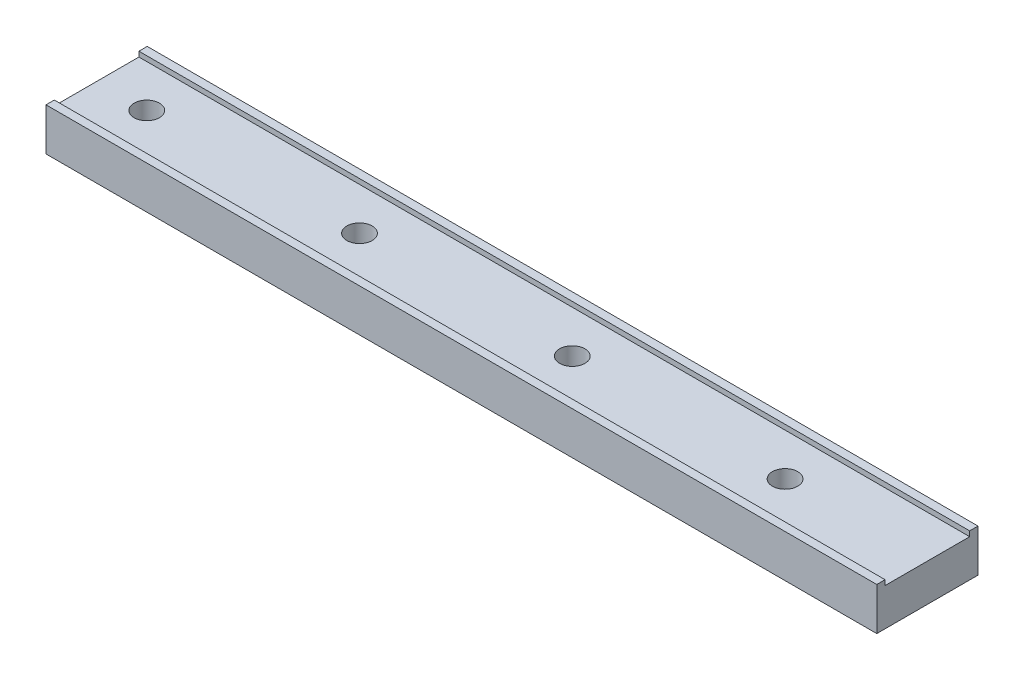
ISO-10303-21;
HEADER;
FILE_DESCRIPTION(('STEP AP214'),'2;1');
FILE_NAME('part.step','',(''),(''),'','','');
FILE_SCHEMA(('AUTOMOTIVE_DESIGN { 1 0 10303 214 1 1 1 1 }'));
ENDSEC;
DATA;
#1=APPLICATION_CONTEXT('core data for automotive mechanical design processes');
#2=APPLICATION_PROTOCOL_DEFINITION('international standard','automotive_design',2000,#1);
#3=PRODUCT_CONTEXT('',#1,'mechanical');
#4=PRODUCT('Part','Part','',(#3));
#5=PRODUCT_RELATED_PRODUCT_CATEGORY('part','',(#4));
#6=PRODUCT_DEFINITION_FORMATION('','',#4);
#7=PRODUCT_DEFINITION_CONTEXT('part definition',#1,'design');
#8=PRODUCT_DEFINITION('design','',#6,#7);
#9=PRODUCT_DEFINITION_SHAPE('','',#8);
#10=(LENGTH_UNIT() NAMED_UNIT(*) SI_UNIT(.MILLI.,.METRE.));
#11=(NAMED_UNIT(*) PLANE_ANGLE_UNIT() SI_UNIT($,.RADIAN.));
#12=(NAMED_UNIT(*) SI_UNIT($,.STERADIAN.) SOLID_ANGLE_UNIT());
#13=UNCERTAINTY_MEASURE_WITH_UNIT(LENGTH_MEASURE(1.E-05),#10,'distance_accuracy_value','');
#14=(GEOMETRIC_REPRESENTATION_CONTEXT(3) GLOBAL_UNCERTAINTY_ASSIGNED_CONTEXT((#13)) GLOBAL_UNIT_ASSIGNED_CONTEXT((#10,
#11,#12)) REPRESENTATION_CONTEXT('',''));
#15=CARTESIAN_POINT('',(0.,0.,0.));
#16=DIRECTION('',(0.,0.,1.));
#17=DIRECTION('',(1.,0.,0.));
#18=AXIS2_PLACEMENT_3D('',#15,#16,#17);
#19=CARTESIAN_POINT('',(0.,9.398,0.));
#20=DIRECTION('',(0.,-1.,0.));
#21=DIRECTION('',(0.,0.,-1.));
#22=AXIS2_PLACEMENT_3D('',#19,#20,#21);
#23=PLANE('',#22);
#24=CARTESIAN_POINT('',(-91.5670000000001,9.398,0.));
#25=DIRECTION('',(0.,1.,0.));
#26=DIRECTION('',(0.,0.,1.));
#27=AXIS2_PLACEMENT_3D('',#24,#25,#26);
#28=CIRCLE('',#27,3.175);
#29=CARTESIAN_POINT('',(-91.5670000000001,9.398,3.175));
#30=VERTEX_POINT('',#29);
#31=EDGE_CURVE('E170',#30,#30,#28,.T.);
#32=ORIENTED_EDGE('',*,*,#31,.F.);
#33=EDGE_LOOP('',(#32));
#34=FACE_BOUND('',#33,.T.);
#35=CARTESIAN_POINT('',(-38.2270000000001,9.398,0.));
#36=DIRECTION('',(0.,1.,0.));
#37=DIRECTION('',(0.,0.,1.));
#38=AXIS2_PLACEMENT_3D('',#35,#36,#37);
#39=CIRCLE('',#38,3.175);
#40=CARTESIAN_POINT('',(-38.2270000000001,9.398,3.175));
#41=VERTEX_POINT('',#40);
#42=EDGE_CURVE('E164',#41,#41,#39,.T.);
#43=ORIENTED_EDGE('',*,*,#42,.F.);
#44=EDGE_LOOP('',(#43));
#45=FACE_BOUND('',#44,.T.);
#46=CARTESIAN_POINT('',(15.1129999999999,9.398,0.));
#47=DIRECTION('',(0.,1.,0.));
#48=DIRECTION('',(0.,0.,1.));
#49=AXIS2_PLACEMENT_3D('',#46,#47,#48);
#50=CIRCLE('',#49,3.175);
#51=CARTESIAN_POINT('',(15.1129999999999,9.398,3.175));
#52=VERTEX_POINT('',#51);
#53=EDGE_CURVE('E158',#52,#52,#50,.T.);
#54=ORIENTED_EDGE('',*,*,#53,.F.);
#55=EDGE_LOOP('',(#54));
#56=FACE_BOUND('',#55,.T.);
#57=CARTESIAN_POINT('',(68.4529999999999,9.398,0.));
#58=DIRECTION('',(0.,1.,0.));
#59=DIRECTION('',(0.,0.,1.));
#60=AXIS2_PLACEMENT_3D('',#57,#58,#59);
#61=CIRCLE('',#60,3.175);
#62=CARTESIAN_POINT('',(68.4529999999999,9.398,3.175));
#63=VERTEX_POINT('',#62);
#64=EDGE_CURVE('E152',#63,#63,#61,.T.);
#65=ORIENTED_EDGE('',*,*,#64,.F.);
#66=EDGE_LOOP('',(#65));
#67=FACE_BOUND('',#66,.T.);
#68=DIRECTION('',(-1.,0.,0.));
#69=VECTOR('',#68,1.);
#70=CARTESIAN_POINT('',(-104.14,9.398,10.6045));
#71=LINE('',#70,#69);
#72=CARTESIAN_POINT('',(104.14,9.398,10.6045));
#73=VERTEX_POINT('',#72);
#74=CARTESIAN_POINT('',(-104.14,9.398,10.6045));
#75=VERTEX_POINT('',#74);
#76=EDGE_CURVE('E48',#73,#75,#71,.T.);
#77=ORIENTED_EDGE('',*,*,#76,.F.);
#78=DIRECTION('',(0.,0.,-1.));
#79=VECTOR('',#78,1.);
#80=CARTESIAN_POINT('',(104.14,9.398,12.6873));
#81=LINE('',#80,#79);
#82=CARTESIAN_POINT('',(104.14,9.398,-10.6045));
#83=VERTEX_POINT('',#82);
#84=EDGE_CURVE('E176',#73,#83,#81,.T.);
#85=ORIENTED_EDGE('',*,*,#84,.T.);
#86=DIRECTION('',(1.,0.,0.));
#87=VECTOR('',#86,1.);
#88=CARTESIAN_POINT('',(-104.14,9.398,-10.6045));
#89=LINE('',#88,#87);
#90=CARTESIAN_POINT('',(-104.14,9.398,-10.6045));
#91=VERTEX_POINT('',#90);
#92=EDGE_CURVE('E131',#91,#83,#89,.T.);
#93=ORIENTED_EDGE('',*,*,#92,.F.);
#94=DIRECTION('',(0.,0.,1.));
#95=VECTOR('',#94,1.);
#96=CARTESIAN_POINT('',(-104.14,9.398,12.6873));
#97=LINE('',#96,#95);
#98=EDGE_CURVE('E53',#91,#75,#97,.T.);
#99=ORIENTED_EDGE('',*,*,#98,.T.);
#100=EDGE_LOOP('',(#77,#85,#93,#99));
#101=FACE_BOUND('',#100,.T.);
#102=ADVANCED_FACE('F33',(#34,#45,#56,#67,#101),#23,.F.);
#103=CARTESIAN_POINT('',(0.,0.,0.));
#104=DIRECTION('',(0.,-1.,0.));
#105=DIRECTION('',(0.,0.,-1.));
#106=AXIS2_PLACEMENT_3D('',#103,#104,#105);
#107=PLANE('',#106);
#108=CARTESIAN_POINT('',(15.1129999999999,0.,0.));
#109=DIRECTION('',(0.,1.,0.));
#110=DIRECTION('',(0.,0.,1.));
#111=AXIS2_PLACEMENT_3D('',#108,#109,#110);
#112=CIRCLE('',#111,3.175);
#113=CARTESIAN_POINT('',(15.1129999999999,0.,3.175));
#114=VERTEX_POINT('',#113);
#115=EDGE_CURVE('E155',#114,#114,#112,.T.);
#116=ORIENTED_EDGE('',*,*,#115,.T.);
#117=EDGE_LOOP('',(#116));
#118=FACE_BOUND('',#117,.T.);
#119=CARTESIAN_POINT('',(-91.5670000000001,0.,0.));
#120=DIRECTION('',(0.,1.,0.));
#121=DIRECTION('',(0.,0.,1.));
#122=AXIS2_PLACEMENT_3D('',#119,#120,#121);
#123=CIRCLE('',#122,3.175);
#124=CARTESIAN_POINT('',(-91.5670000000001,0.,3.175));
#125=VERTEX_POINT('',#124);
#126=EDGE_CURVE('E167',#125,#125,#123,.T.);
#127=ORIENTED_EDGE('',*,*,#126,.T.);
#128=EDGE_LOOP('',(#127));
#129=FACE_BOUND('',#128,.T.);
#130=DIRECTION('',(0.,0.,-1.));
#131=VECTOR('',#130,1.);
#132=CARTESIAN_POINT('',(104.14,0.,12.6873));
#133=LINE('',#132,#131);
#134=CARTESIAN_POINT('',(104.14,0.,12.6873));
#135=VERTEX_POINT('',#134);
#136=CARTESIAN_POINT('',(104.14,0.,-12.6873));
#137=VERTEX_POINT('',#136);
#138=EDGE_CURVE('E173',#135,#137,#133,.T.);
#139=ORIENTED_EDGE('',*,*,#138,.F.);
#140=DIRECTION('',(1.,0.,0.));
#141=VECTOR('',#140,1.);
#142=CARTESIAN_POINT('',(-104.14,0.,12.6873));
#143=LINE('',#142,#141);
#144=CARTESIAN_POINT('',(-104.14,0.,12.6873));
#145=VERTEX_POINT('',#144);
#146=EDGE_CURVE('E178',#145,#135,#143,.T.);
#147=ORIENTED_EDGE('',*,*,#146,.F.);
#148=DIRECTION('',(0.,0.,1.));
#149=VECTOR('',#148,1.);
#150=CARTESIAN_POINT('',(-104.14,0.,12.6873));
#151=LINE('',#150,#149);
#152=CARTESIAN_POINT('',(-104.14,0.,-12.6873));
#153=VERTEX_POINT('',#152);
#154=EDGE_CURVE('E104',#153,#145,#151,.T.);
#155=ORIENTED_EDGE('',*,*,#154,.F.);
#156=DIRECTION('',(-1.,0.,0.));
#157=VECTOR('',#156,1.);
#158=CARTESIAN_POINT('',(-104.14,0.,-12.6873));
#159=LINE('',#158,#157);
#160=EDGE_CURVE('E182',#137,#153,#159,.T.);
#161=ORIENTED_EDGE('',*,*,#160,.F.);
#162=EDGE_LOOP('',(#139,#147,#155,#161));
#163=FACE_BOUND('',#162,.T.);
#164=CARTESIAN_POINT('',(-38.2270000000001,0.,0.));
#165=DIRECTION('',(0.,1.,0.));
#166=DIRECTION('',(0.,0.,1.));
#167=AXIS2_PLACEMENT_3D('',#164,#165,#166);
#168=CIRCLE('',#167,3.175);
#169=CARTESIAN_POINT('',(-38.2270000000001,0.,3.175));
#170=VERTEX_POINT('',#169);
#171=EDGE_CURVE('E161',#170,#170,#168,.T.);
#172=ORIENTED_EDGE('',*,*,#171,.T.);
#173=EDGE_LOOP('',(#172));
#174=FACE_BOUND('',#173,.T.);
#175=CARTESIAN_POINT('',(68.4529999999999,0.,0.));
#176=DIRECTION('',(0.,1.,0.));
#177=DIRECTION('',(0.,0.,1.));
#178=AXIS2_PLACEMENT_3D('',#175,#176,#177);
#179=CIRCLE('',#178,3.175);
#180=CARTESIAN_POINT('',(68.4529999999999,0.,3.175));
#181=VERTEX_POINT('',#180);
#182=EDGE_CURVE('E151',#181,#181,#179,.T.);
#183=ORIENTED_EDGE('',*,*,#182,.T.);
#184=EDGE_LOOP('',(#183));
#185=FACE_BOUND('',#184,.T.);
#186=ADVANCED_FACE('F192',(#118,#129,#163,#174,#185),#107,.T.);
#187=CARTESIAN_POINT('',(104.14,9.398,12.6873));
#188=DIRECTION('',(-1.,0.,0.));
#189=DIRECTION('',(0.,0.,1.));
#190=AXIS2_PLACEMENT_3D('',#187,#188,#189);
#191=PLANE('',#190);
#192=ORIENTED_EDGE('',*,*,#138,.T.);
#193=DIRECTION('',(0.,-1.,0.));
#194=VECTOR('',#193,1.);
#195=CARTESIAN_POINT('',(104.14,9.398,-12.6873));
#196=LINE('',#195,#194);
#197=CARTESIAN_POINT('',(104.14,10.668,-12.6873));
#198=VERTEX_POINT('',#197);
#199=EDGE_CURVE('E11',#198,#137,#196,.T.);
#200=ORIENTED_EDGE('',*,*,#199,.F.);
#201=DIRECTION('',(0.,0.,-1.));
#202=VECTOR('',#201,1.);
#203=CARTESIAN_POINT('',(104.14,10.668,-12.6873));
#204=LINE('',#203,#202);
#205=CARTESIAN_POINT('',(104.14,10.668,-10.6045));
#206=VERTEX_POINT('',#205);
#207=EDGE_CURVE('E137',#206,#198,#204,.T.);
#208=ORIENTED_EDGE('',*,*,#207,.F.);
#209=DIRECTION('',(0.,-1.,0.));
#210=VECTOR('',#209,1.);
#211=CARTESIAN_POINT('',(104.14,10.668,-10.6045));
#212=LINE('',#211,#210);
#213=EDGE_CURVE('E143',#206,#83,#212,.T.);
#214=ORIENTED_EDGE('',*,*,#213,.T.);
#215=ORIENTED_EDGE('',*,*,#84,.F.);
#216=DIRECTION('',(0.,-1.,0.));
#217=VECTOR('',#216,1.);
#218=CARTESIAN_POINT('',(104.14,10.668,10.6045));
#219=LINE('',#218,#217);
#220=CARTESIAN_POINT('',(104.14,10.668,10.6045));
#221=VERTEX_POINT('',#220);
#222=EDGE_CURVE('E128',#221,#73,#219,.T.);
#223=ORIENTED_EDGE('',*,*,#222,.F.);
#224=DIRECTION('',(0.,0.,-1.));
#225=VECTOR('',#224,1.);
#226=CARTESIAN_POINT('',(104.14,10.668,12.6873));
#227=LINE('',#226,#225);
#228=CARTESIAN_POINT('',(104.14,10.668,12.6873));
#229=VERTEX_POINT('',#228);
#230=EDGE_CURVE('E115',#229,#221,#227,.T.);
#231=ORIENTED_EDGE('',*,*,#230,.F.);
#232=DIRECTION('',(0.,-1.,0.));
#233=VECTOR('',#232,1.);
#234=CARTESIAN_POINT('',(104.14,9.398,12.6873));
#235=LINE('',#234,#233);
#236=EDGE_CURVE('E107',#229,#135,#235,.T.);
#237=ORIENTED_EDGE('',*,*,#236,.T.);
#238=EDGE_LOOP('',(#192,#200,#208,#214,#215,#223,#231,#237));
#239=FACE_BOUND('',#238,.T.);
#240=ADVANCED_FACE('F35',(#239),#191,.F.);
#241=CARTESIAN_POINT('',(-104.14,9.398,-12.6873));
#242=DIRECTION('',(0.,0.,1.));
#243=DIRECTION('',(1.,0.,0.));
#244=AXIS2_PLACEMENT_3D('',#241,#242,#243);
#245=PLANE('',#244);
#246=ORIENTED_EDGE('',*,*,#160,.T.);
#247=DIRECTION('',(0.,-1.,0.));
#248=VECTOR('',#247,1.);
#249=CARTESIAN_POINT('',(-104.14,9.398,-12.6873));
#250=LINE('',#249,#248);
#251=CARTESIAN_POINT('',(-104.14,10.668,-12.6873));
#252=VERTEX_POINT('',#251);
#253=EDGE_CURVE('E41',#252,#153,#250,.T.);
#254=ORIENTED_EDGE('',*,*,#253,.F.);
#255=DIRECTION('',(-1.,0.,0.));
#256=VECTOR('',#255,1.);
#257=CARTESIAN_POINT('',(-104.14,10.668,-12.6873));
#258=LINE('',#257,#256);
#259=EDGE_CURVE('E140',#198,#252,#258,.T.);
#260=ORIENTED_EDGE('',*,*,#259,.F.);
#261=ORIENTED_EDGE('',*,*,#199,.T.);
#262=EDGE_LOOP('',(#246,#254,#260,#261));
#263=FACE_BOUND('',#262,.T.);
#264=ADVANCED_FACE('F204',(#263),#245,.F.);
#265=CARTESIAN_POINT('',(-104.14,9.398,12.6873));
#266=DIRECTION('',(1.,0.,0.));
#267=DIRECTION('',(0.,0.,-1.));
#268=AXIS2_PLACEMENT_3D('',#265,#266,#267);
#269=PLANE('',#268);
#270=ORIENTED_EDGE('',*,*,#154,.T.);
#271=DIRECTION('',(0.,-1.,0.));
#272=VECTOR('',#271,1.);
#273=CARTESIAN_POINT('',(-104.14,9.398,12.6873));
#274=LINE('',#273,#272);
#275=CARTESIAN_POINT('',(-104.14,10.668,12.6873));
#276=VERTEX_POINT('',#275);
#277=EDGE_CURVE('E96',#276,#145,#274,.T.);
#278=ORIENTED_EDGE('',*,*,#277,.F.);
#279=DIRECTION('',(0.,0.,1.));
#280=VECTOR('',#279,1.);
#281=CARTESIAN_POINT('',(-104.14,10.668,12.6873));
#282=LINE('',#281,#280);
#283=CARTESIAN_POINT('',(-104.14,10.668,10.6045));
#284=VERTEX_POINT('',#283);
#285=EDGE_CURVE('E101',#284,#276,#282,.T.);
#286=ORIENTED_EDGE('',*,*,#285,.F.);
#287=DIRECTION('',(0.,-1.,0.));
#288=VECTOR('',#287,1.);
#289=CARTESIAN_POINT('',(-104.14,10.668,10.6045));
#290=LINE('',#289,#288);
#291=EDGE_CURVE('E125',#284,#75,#290,.T.);
#292=ORIENTED_EDGE('',*,*,#291,.T.);
#293=ORIENTED_EDGE('',*,*,#98,.F.);
#294=DIRECTION('',(0.,-1.,0.));
#295=VECTOR('',#294,1.);
#296=CARTESIAN_POINT('',(-104.14,10.668,-10.6045));
#297=LINE('',#296,#295);
#298=CARTESIAN_POINT('',(-104.14,10.668,-10.6045));
#299=VERTEX_POINT('',#298);
#300=EDGE_CURVE('E148',#299,#91,#297,.T.);
#301=ORIENTED_EDGE('',*,*,#300,.F.);
#302=DIRECTION('',(0.,0.,1.));
#303=VECTOR('',#302,1.);
#304=CARTESIAN_POINT('',(-104.14,10.668,-12.6873));
#305=LINE('',#304,#303);
#306=EDGE_CURVE('E132',#252,#299,#305,.T.);
#307=ORIENTED_EDGE('',*,*,#306,.F.);
#308=ORIENTED_EDGE('',*,*,#253,.T.);
#309=EDGE_LOOP('',(#270,#278,#286,#292,#293,#301,#307,#308));
#310=FACE_BOUND('',#309,.T.);
#311=ADVANCED_FACE('F98',(#310),#269,.F.);
#312=CARTESIAN_POINT('',(-104.14,9.398,12.6873));
#313=DIRECTION('',(0.,0.,-1.));
#314=DIRECTION('',(-1.,0.,0.));
#315=AXIS2_PLACEMENT_3D('',#312,#313,#314);
#316=PLANE('',#315);
#317=ORIENTED_EDGE('',*,*,#146,.T.);
#318=ORIENTED_EDGE('',*,*,#236,.F.);
#319=DIRECTION('',(1.,0.,0.));
#320=VECTOR('',#319,1.);
#321=CARTESIAN_POINT('',(-104.14,10.668,12.6873));
#322=LINE('',#321,#320);
#323=EDGE_CURVE('E110',#276,#229,#322,.T.);
#324=ORIENTED_EDGE('',*,*,#323,.F.);
#325=ORIENTED_EDGE('',*,*,#277,.T.);
#326=EDGE_LOOP('',(#317,#318,#324,#325));
#327=FACE_BOUND('',#326,.T.);
#328=ADVANCED_FACE('F111',(#327),#316,.F.);
#329=CARTESIAN_POINT('',(-91.5670000000001,9.398,0.));
#330=DIRECTION('',(0.,-1.,0.));
#331=DIRECTION('',(0.,0.,-1.));
#332=AXIS2_PLACEMENT_3D('',#329,#330,#331);
#333=CYLINDRICAL_SURFACE('',#332,3.175);
#334=ORIENTED_EDGE('',*,*,#31,.T.);
#335=EDGE_LOOP('',(#334));
#336=FACE_BOUND('',#335,.T.);
#337=ORIENTED_EDGE('',*,*,#126,.F.);
#338=EDGE_LOOP('',(#337));
#339=FACE_BOUND('',#338,.T.);
#340=ADVANCED_FACE('F222',(#336,#339),#333,.F.);
#341=CARTESIAN_POINT('',(-38.2270000000001,9.398,0.));
#342=DIRECTION('',(0.,-1.,0.));
#343=DIRECTION('',(0.,0.,-1.));
#344=AXIS2_PLACEMENT_3D('',#341,#342,#343);
#345=CYLINDRICAL_SURFACE('',#344,3.175);
#346=ORIENTED_EDGE('',*,*,#42,.T.);
#347=EDGE_LOOP('',(#346));
#348=FACE_BOUND('',#347,.T.);
#349=ORIENTED_EDGE('',*,*,#171,.F.);
#350=EDGE_LOOP('',(#349));
#351=FACE_BOUND('',#350,.T.);
#352=ADVANCED_FACE('F229',(#348,#351),#345,.F.);
#353=CARTESIAN_POINT('',(15.1129999999999,9.398,0.));
#354=DIRECTION('',(0.,-1.,0.));
#355=DIRECTION('',(0.,0.,-1.));
#356=AXIS2_PLACEMENT_3D('',#353,#354,#355);
#357=CYLINDRICAL_SURFACE('',#356,3.175);
#358=ORIENTED_EDGE('',*,*,#53,.T.);
#359=EDGE_LOOP('',(#358));
#360=FACE_BOUND('',#359,.T.);
#361=ORIENTED_EDGE('',*,*,#115,.F.);
#362=EDGE_LOOP('',(#361));
#363=FACE_BOUND('',#362,.T.);
#364=ADVANCED_FACE('F234',(#360,#363),#357,.F.);
#365=CARTESIAN_POINT('',(68.4529999999999,9.398,0.));
#366=DIRECTION('',(0.,-1.,0.));
#367=DIRECTION('',(0.,0.,-1.));
#368=AXIS2_PLACEMENT_3D('',#365,#366,#367);
#369=CYLINDRICAL_SURFACE('',#368,3.175);
#370=ORIENTED_EDGE('',*,*,#64,.T.);
#371=EDGE_LOOP('',(#370));
#372=FACE_BOUND('',#371,.T.);
#373=ORIENTED_EDGE('',*,*,#182,.F.);
#374=EDGE_LOOP('',(#373));
#375=FACE_BOUND('',#374,.T.);
#376=ADVANCED_FACE('F242',(#372,#375),#369,.F.);
#377=CARTESIAN_POINT('',(-104.14,10.668,-10.6045));
#378=DIRECTION('',(0.,0.,-1.));
#379=DIRECTION('',(-1.,0.,0.));
#380=AXIS2_PLACEMENT_3D('',#377,#378,#379);
#381=PLANE('',#380);
#382=ORIENTED_EDGE('',*,*,#92,.T.);
#383=ORIENTED_EDGE('',*,*,#213,.F.);
#384=DIRECTION('',(1.,0.,0.));
#385=VECTOR('',#384,1.);
#386=CARTESIAN_POINT('',(-104.14,10.668,-10.6045));
#387=LINE('',#386,#385);
#388=EDGE_CURVE('E135',#299,#206,#387,.T.);
#389=ORIENTED_EDGE('',*,*,#388,.F.);
#390=ORIENTED_EDGE('',*,*,#300,.T.);
#391=EDGE_LOOP('',(#382,#383,#389,#390));
#392=FACE_BOUND('',#391,.T.);
#393=ADVANCED_FACE('F199',(#392),#381,.F.);
#394=CARTESIAN_POINT('',(0.,10.668,0.));
#395=DIRECTION('',(0.,1.,0.));
#396=DIRECTION('',(0.,0.,1.));
#397=AXIS2_PLACEMENT_3D('',#394,#395,#396);
#398=PLANE('',#397);
#399=ORIENTED_EDGE('',*,*,#306,.T.);
#400=ORIENTED_EDGE('',*,*,#388,.T.);
#401=ORIENTED_EDGE('',*,*,#207,.T.);
#402=ORIENTED_EDGE('',*,*,#259,.T.);
#403=EDGE_LOOP('',(#399,#400,#401,#402));
#404=FACE_BOUND('',#403,.T.);
#405=ADVANCED_FACE('F203',(#404),#398,.T.);
#406=CARTESIAN_POINT('',(-104.14,10.668,10.6045));
#407=DIRECTION('',(0.,0.,1.));
#408=DIRECTION('',(1.,0.,0.));
#409=AXIS2_PLACEMENT_3D('',#406,#407,#408);
#410=PLANE('',#409);
#411=ORIENTED_EDGE('',*,*,#76,.T.);
#412=ORIENTED_EDGE('',*,*,#291,.F.);
#413=DIRECTION('',(-1.,0.,0.));
#414=VECTOR('',#413,1.);
#415=CARTESIAN_POINT('',(-104.14,10.668,10.6045));
#416=LINE('',#415,#414);
#417=EDGE_CURVE('E119',#221,#284,#416,.T.);
#418=ORIENTED_EDGE('',*,*,#417,.F.);
#419=ORIENTED_EDGE('',*,*,#222,.T.);
#420=EDGE_LOOP('',(#411,#412,#418,#419));
#421=FACE_BOUND('',#420,.T.);
#422=ADVANCED_FACE('F197',(#421),#410,.F.);
#423=CARTESIAN_POINT('',(0.,10.668,0.));
#424=DIRECTION('',(0.,-1.,0.));
#425=DIRECTION('',(0.,0.,-1.));
#426=AXIS2_PLACEMENT_3D('',#423,#424,#425);
#427=PLANE('',#426);
#428=ORIENTED_EDGE('',*,*,#285,.T.);
#429=ORIENTED_EDGE('',*,*,#323,.T.);
#430=ORIENTED_EDGE('',*,*,#230,.T.);
#431=ORIENTED_EDGE('',*,*,#417,.T.);
#432=EDGE_LOOP('',(#428,#429,#430,#431));
#433=FACE_BOUND('',#432,.T.);
#434=ADVANCED_FACE('F117',(#433),#427,.F.);
#435=CLOSED_SHELL('',(#102,#186,#240,#264,#311,#328,#340,#352,#364,#376,#393,#405,#422,#434));
#436=MANIFOLD_SOLID_BREP('B2',#435);
#437=ADVANCED_BREP_SHAPE_REPRESENTATION('',(#18,#436),#14);
#438=SHAPE_DEFINITION_REPRESENTATION(#9,#437);
ENDSEC;
END-ISO-10303-21;
